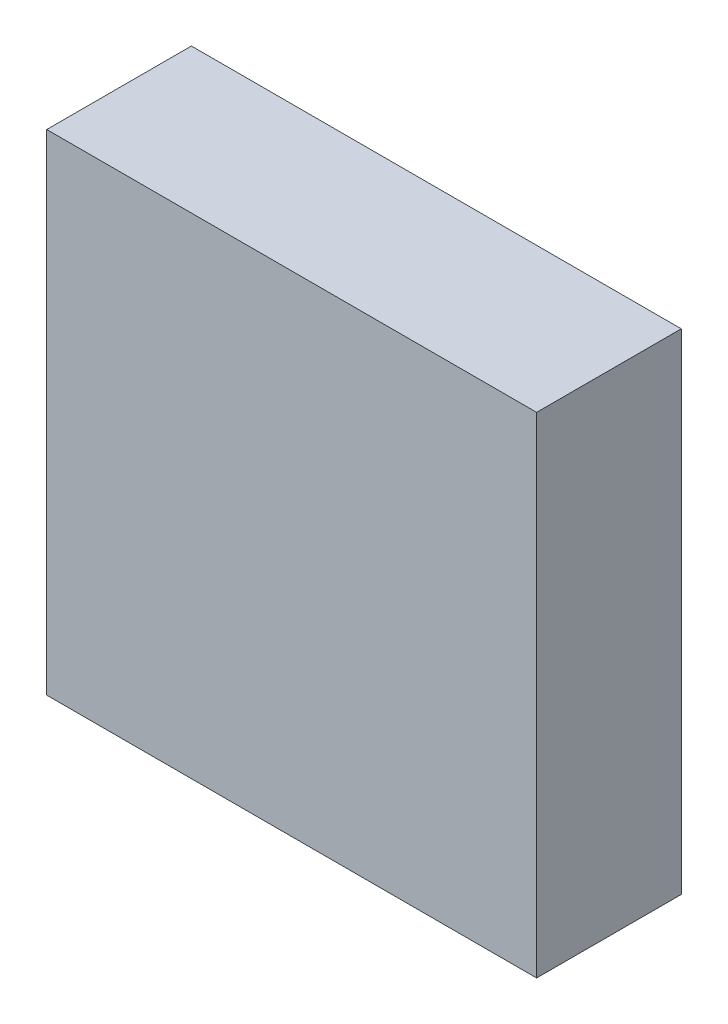
ISO-10303-21;
HEADER;
FILE_DESCRIPTION(('STEP AP214'),'2;1');
FILE_NAME('part.step','',(''),(''),'','','');
FILE_SCHEMA(('AUTOMOTIVE_DESIGN { 1 0 10303 214 1 1 1 1 }'));
ENDSEC;
DATA;
#1=APPLICATION_CONTEXT('core data for automotive mechanical design processes');
#2=APPLICATION_PROTOCOL_DEFINITION('international standard','automotive_design',2000,#1);
#3=PRODUCT_CONTEXT('',#1,'mechanical');
#4=PRODUCT('Part','Part','',(#3));
#5=PRODUCT_RELATED_PRODUCT_CATEGORY('part','',(#4));
#6=PRODUCT_DEFINITION_FORMATION('','',#4);
#7=PRODUCT_DEFINITION_CONTEXT('part definition',#1,'design');
#8=PRODUCT_DEFINITION('design','',#6,#7);
#9=PRODUCT_DEFINITION_SHAPE('','',#8);
#10=(LENGTH_UNIT() NAMED_UNIT(*) SI_UNIT(.MILLI.,.METRE.));
#11=(NAMED_UNIT(*) PLANE_ANGLE_UNIT() SI_UNIT($,.RADIAN.));
#12=(NAMED_UNIT(*) SI_UNIT($,.STERADIAN.) SOLID_ANGLE_UNIT());
#13=UNCERTAINTY_MEASURE_WITH_UNIT(LENGTH_MEASURE(1.E-05),#10,'distance_accuracy_value','');
#14=(GEOMETRIC_REPRESENTATION_CONTEXT(3) GLOBAL_UNCERTAINTY_ASSIGNED_CONTEXT((#13)) GLOBAL_UNIT_ASSIGNED_CONTEXT((#10,
#11,#12)) REPRESENTATION_CONTEXT('',''));
#15=CARTESIAN_POINT('',(0.,0.,0.));
#16=DIRECTION('',(0.,0.,1.));
#17=DIRECTION('',(1.,0.,0.));
#18=AXIS2_PLACEMENT_3D('',#15,#16,#17);
#19=CARTESIAN_POINT('',(-224.34205534876,272.505886440584,150.));
#20=DIRECTION('',(1.,0.,0.));
#21=DIRECTION('',(0.,1.,0.));
#22=AXIS2_PLACEMENT_3D('',#19,#20,#21);
#23=PLANE('',#22);
#24=DIRECTION('',(0.,-1.,0.));
#25=VECTOR('',#24,1.);
#26=CARTESIAN_POINT('',(-224.34205534876,272.505886440584,0.));
#27=LINE('',#26,#25);
#28=CARTESIAN_POINT('',(-224.34205534876,272.505886440584,0.));
#29=VERTEX_POINT('',#28);
#30=CARTESIAN_POINT('',(-224.34205534876,-235.494113559416,0.));
#31=VERTEX_POINT('',#30);
#32=EDGE_CURVE('E98',#29,#31,#27,.T.);
#33=ORIENTED_EDGE('',*,*,#32,.T.);
#34=DIRECTION('',(0.,0.,-1.));
#35=VECTOR('',#34,1.);
#36=CARTESIAN_POINT('',(-224.34205534876,-235.494113559416,150.));
#37=LINE('',#36,#35);
#38=CARTESIAN_POINT('',(-224.34205534876,-235.494113559416,150.));
#39=VERTEX_POINT('',#38);
#40=EDGE_CURVE('E11',#39,#31,#37,.T.);
#41=ORIENTED_EDGE('',*,*,#40,.F.);
#42=DIRECTION('',(0.,-1.,0.));
#43=VECTOR('',#42,1.);
#44=CARTESIAN_POINT('',(-224.34205534876,272.505886440584,150.));
#45=LINE('',#44,#43);
#46=CARTESIAN_POINT('',(-224.34205534876,272.505886440584,150.));
#47=VERTEX_POINT('',#46);
#48=EDGE_CURVE('E86',#47,#39,#45,.T.);
#49=ORIENTED_EDGE('',*,*,#48,.F.);
#50=DIRECTION('',(0.,0.,-1.));
#51=VECTOR('',#50,1.);
#52=CARTESIAN_POINT('',(-224.34205534876,272.505886440584,150.));
#53=LINE('',#52,#51);
#54=EDGE_CURVE('E94',#47,#29,#53,.T.);
#55=ORIENTED_EDGE('',*,*,#54,.T.);
#56=EDGE_LOOP('',(#33,#41,#49,#55));
#57=FACE_BOUND('',#56,.T.);
#58=ADVANCED_FACE('F35',(#57),#23,.F.);
#59=CARTESIAN_POINT('',(-224.34205534876,-235.494113559416,150.));
#60=DIRECTION('',(0.,1.,0.));
#61=DIRECTION('',(0.,0.,1.));
#62=AXIS2_PLACEMENT_3D('',#59,#60,#61);
#63=PLANE('',#62);
#64=DIRECTION('',(1.,0.,0.));
#65=VECTOR('',#64,1.);
#66=CARTESIAN_POINT('',(-224.34205534876,-235.494113559416,0.));
#67=LINE('',#66,#65);
#68=CARTESIAN_POINT('',(283.65794465124,-235.494113559416,0.));
#69=VERTEX_POINT('',#68);
#70=EDGE_CURVE('E90',#31,#69,#67,.T.);
#71=ORIENTED_EDGE('',*,*,#70,.T.);
#72=DIRECTION('',(0.,0.,-1.));
#73=VECTOR('',#72,1.);
#74=CARTESIAN_POINT('',(283.65794465124,-235.494113559416,150.));
#75=LINE('',#74,#73);
#76=CARTESIAN_POINT('',(283.65794465124,-235.494113559416,150.));
#77=VERTEX_POINT('',#76);
#78=EDGE_CURVE('E43',#77,#69,#75,.T.);
#79=ORIENTED_EDGE('',*,*,#78,.F.);
#80=DIRECTION('',(1.,0.,0.));
#81=VECTOR('',#80,1.);
#82=CARTESIAN_POINT('',(-224.34205534876,-235.494113559416,150.));
#83=LINE('',#82,#81);
#84=EDGE_CURVE('E81',#39,#77,#83,.T.);
#85=ORIENTED_EDGE('',*,*,#84,.F.);
#86=ORIENTED_EDGE('',*,*,#40,.T.);
#87=EDGE_LOOP('',(#71,#79,#85,#86));
#88=FACE_BOUND('',#87,.T.);
#89=ADVANCED_FACE('F89',(#88),#63,.F.);
#90=CARTESIAN_POINT('',(283.65794465124,272.505886440584,150.));
#91=DIRECTION('',(-1.,0.,0.));
#92=DIRECTION('',(0.,-1.,0.));
#93=AXIS2_PLACEMENT_3D('',#90,#91,#92);
#94=PLANE('',#93);
#95=DIRECTION('',(0.,1.,0.));
#96=VECTOR('',#95,1.);
#97=CARTESIAN_POINT('',(283.65794465124,272.505886440584,0.));
#98=LINE('',#97,#96);
#99=CARTESIAN_POINT('',(283.65794465124,272.505886440584,0.));
#100=VERTEX_POINT('',#99);
#101=EDGE_CURVE('E68',#69,#100,#98,.T.);
#102=ORIENTED_EDGE('',*,*,#101,.T.);
#103=DIRECTION('',(0.,0.,-1.));
#104=VECTOR('',#103,1.);
#105=CARTESIAN_POINT('',(283.65794465124,272.505886440584,150.));
#106=LINE('',#105,#104);
#107=CARTESIAN_POINT('',(283.65794465124,272.505886440584,150.));
#108=VERTEX_POINT('',#107);
#109=EDGE_CURVE('E91',#108,#100,#106,.T.);
#110=ORIENTED_EDGE('',*,*,#109,.F.);
#111=DIRECTION('',(0.,1.,0.));
#112=VECTOR('',#111,1.);
#113=CARTESIAN_POINT('',(283.65794465124,272.505886440584,150.));
#114=LINE('',#113,#112);
#115=EDGE_CURVE('E84',#77,#108,#114,.T.);
#116=ORIENTED_EDGE('',*,*,#115,.F.);
#117=ORIENTED_EDGE('',*,*,#78,.T.);
#118=EDGE_LOOP('',(#102,#110,#116,#117));
#119=FACE_BOUND('',#118,.T.);
#120=ADVANCED_FACE('F92',(#119),#94,.F.);
#121=CARTESIAN_POINT('',(-224.34205534876,272.505886440584,150.));
#122=DIRECTION('',(0.,-1.,0.));
#123=DIRECTION('',(0.,0.,-1.));
#124=AXIS2_PLACEMENT_3D('',#121,#122,#123);
#125=PLANE('',#124);
#126=DIRECTION('',(-1.,0.,0.));
#127=VECTOR('',#126,1.);
#128=CARTESIAN_POINT('',(-224.34205534876,272.505886440584,0.));
#129=LINE('',#128,#127);
#130=EDGE_CURVE('E74',#100,#29,#129,.T.);
#131=ORIENTED_EDGE('',*,*,#130,.T.);
#132=ORIENTED_EDGE('',*,*,#54,.F.);
#133=DIRECTION('',(-1.,0.,0.));
#134=VECTOR('',#133,1.);
#135=CARTESIAN_POINT('',(-224.34205534876,272.505886440584,150.));
#136=LINE('',#135,#134);
#137=EDGE_CURVE('E51',#108,#47,#136,.T.);
#138=ORIENTED_EDGE('',*,*,#137,.F.);
#139=ORIENTED_EDGE('',*,*,#109,.T.);
#140=EDGE_LOOP('',(#131,#132,#138,#139));
#141=FACE_BOUND('',#140,.T.);
#142=ADVANCED_FACE('F105',(#141),#125,.F.);
#143=CARTESIAN_POINT('',(0.,0.,150.));
#144=DIRECTION('',(0.,0.,1.));
#145=DIRECTION('',(1.,0.,0.));
#146=AXIS2_PLACEMENT_3D('',#143,#144,#145);
#147=PLANE('',#146);
#148=ORIENTED_EDGE('',*,*,#48,.T.);
#149=ORIENTED_EDGE('',*,*,#84,.T.);
#150=ORIENTED_EDGE('',*,*,#115,.T.);
#151=ORIENTED_EDGE('',*,*,#137,.T.);
#152=EDGE_LOOP('',(#148,#149,#150,#151));
#153=FACE_BOUND('',#152,.T.);
#154=ADVANCED_FACE('F82',(#153),#147,.T.);
#155=CARTESIAN_POINT('',(0.,0.,0.));
#156=DIRECTION('',(0.,0.,1.));
#157=DIRECTION('',(1.,0.,0.));
#158=AXIS2_PLACEMENT_3D('',#155,#156,#157);
#159=PLANE('',#158);
#160=ORIENTED_EDGE('',*,*,#32,.F.);
#161=ORIENTED_EDGE('',*,*,#130,.F.);
#162=ORIENTED_EDGE('',*,*,#101,.F.);
#163=ORIENTED_EDGE('',*,*,#70,.F.);
#164=EDGE_LOOP('',(#160,#161,#162,#163));
#165=FACE_BOUND('',#164,.T.);
#166=ADVANCED_FACE('F108',(#165),#159,.F.);
#167=CLOSED_SHELL('',(#58,#89,#120,#142,#154,#166));
#168=MANIFOLD_SOLID_BREP('B2',#167);
#169=ADVANCED_BREP_SHAPE_REPRESENTATION('',(#18,#168),#14);
#170=SHAPE_DEFINITION_REPRESENTATION(#9,#169);
ENDSEC;
END-ISO-10303-21;
